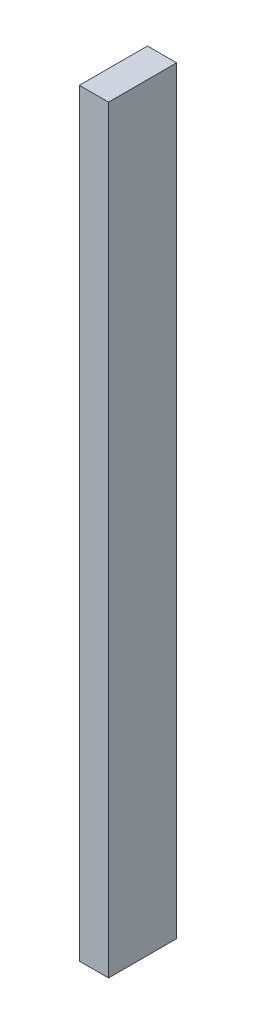
ISO-10303-21;
HEADER;
FILE_DESCRIPTION(('STEP AP214'),'2;1');
FILE_NAME('part.step','',(''),(''),'','','');
FILE_SCHEMA(('AUTOMOTIVE_DESIGN { 1 0 10303 214 1 1 1 1 }'));
ENDSEC;
DATA;
#1=APPLICATION_CONTEXT('core data for automotive mechanical design processes');
#2=APPLICATION_PROTOCOL_DEFINITION('international standard','automotive_design',2000,#1);
#3=PRODUCT_CONTEXT('',#1,'mechanical');
#4=PRODUCT('Part','Part','',(#3));
#5=PRODUCT_RELATED_PRODUCT_CATEGORY('part','',(#4));
#6=PRODUCT_DEFINITION_FORMATION('','',#4);
#7=PRODUCT_DEFINITION_CONTEXT('part definition',#1,'design');
#8=PRODUCT_DEFINITION('design','',#6,#7);
#9=PRODUCT_DEFINITION_SHAPE('','',#8);
#10=(LENGTH_UNIT() NAMED_UNIT(*) SI_UNIT(.MILLI.,.METRE.));
#11=(NAMED_UNIT(*) PLANE_ANGLE_UNIT() SI_UNIT($,.RADIAN.));
#12=(NAMED_UNIT(*) SI_UNIT($,.STERADIAN.) SOLID_ANGLE_UNIT());
#13=UNCERTAINTY_MEASURE_WITH_UNIT(LENGTH_MEASURE(1.E-05),#10,'distance_accuracy_value','');
#14=(GEOMETRIC_REPRESENTATION_CONTEXT(3) GLOBAL_UNCERTAINTY_ASSIGNED_CONTEXT((#13)) GLOBAL_UNIT_ASSIGNED_CONTEXT((#10,
#11,#12)) REPRESENTATION_CONTEXT('',''));
#15=CARTESIAN_POINT('',(0.,0.,0.));
#16=DIRECTION('',(0.,0.,1.));
#17=DIRECTION('',(1.,0.,0.));
#18=AXIS2_PLACEMENT_3D('',#15,#16,#17);
#19=CARTESIAN_POINT('',(19.05,495.3,44.45));
#20=DIRECTION('',(-1.,0.,0.));
#21=DIRECTION('',(0.,0.,1.));
#22=AXIS2_PLACEMENT_3D('',#19,#20,#21);
#23=PLANE('',#22);
#24=DIRECTION('',(0.,0.,-1.));
#25=VECTOR('',#24,1.);
#26=CARTESIAN_POINT('',(19.05,-495.3,44.45));
#27=LINE('',#26,#25);
#28=CARTESIAN_POINT('',(19.05,-495.3,44.45));
#29=VERTEX_POINT('',#28);
#30=CARTESIAN_POINT('',(19.05,-495.3,-44.45));
#31=VERTEX_POINT('',#30);
#32=EDGE_CURVE('E95',#29,#31,#27,.T.);
#33=ORIENTED_EDGE('',*,*,#32,.T.);
#34=DIRECTION('',(0.,-1.,0.));
#35=VECTOR('',#34,1.);
#36=CARTESIAN_POINT('',(19.05,495.3,-44.45));
#37=LINE('',#36,#35);
#38=CARTESIAN_POINT('',(19.05,495.3,-44.45));
#39=VERTEX_POINT('',#38);
#40=EDGE_CURVE('E11',#39,#31,#37,.T.);
#41=ORIENTED_EDGE('',*,*,#40,.F.);
#42=DIRECTION('',(0.,0.,-1.));
#43=VECTOR('',#42,1.);
#44=CARTESIAN_POINT('',(19.05,495.3,44.45));
#45=LINE('',#44,#43);
#46=CARTESIAN_POINT('',(19.05,495.3,44.45));
#47=VERTEX_POINT('',#46);
#48=EDGE_CURVE('E83',#47,#39,#45,.T.);
#49=ORIENTED_EDGE('',*,*,#48,.F.);
#50=DIRECTION('',(0.,-1.,0.));
#51=VECTOR('',#50,1.);
#52=CARTESIAN_POINT('',(19.05,495.3,44.45));
#53=LINE('',#52,#51);
#54=EDGE_CURVE('E91',#47,#29,#53,.T.);
#55=ORIENTED_EDGE('',*,*,#54,.T.);
#56=EDGE_LOOP('',(#33,#41,#49,#55));
#57=FACE_BOUND('',#56,.T.);
#58=ADVANCED_FACE('F32',(#57),#23,.F.);
#59=CARTESIAN_POINT('',(-19.05,495.3,-44.45));
#60=DIRECTION('',(0.,0.,1.));
#61=DIRECTION('',(1.,0.,0.));
#62=AXIS2_PLACEMENT_3D('',#59,#60,#61);
#63=PLANE('',#62);
#64=DIRECTION('',(-1.,0.,0.));
#65=VECTOR('',#64,1.);
#66=CARTESIAN_POINT('',(-19.05,-495.3,-44.45));
#67=LINE('',#66,#65);
#68=CARTESIAN_POINT('',(-19.05,-495.3,-44.45));
#69=VERTEX_POINT('',#68);
#70=EDGE_CURVE('E87',#31,#69,#67,.T.);
#71=ORIENTED_EDGE('',*,*,#70,.T.);
#72=DIRECTION('',(0.,-1.,0.));
#73=VECTOR('',#72,1.);
#74=CARTESIAN_POINT('',(-19.05,495.3,-44.45));
#75=LINE('',#74,#73);
#76=CARTESIAN_POINT('',(-19.05,495.3,-44.45));
#77=VERTEX_POINT('',#76);
#78=EDGE_CURVE('E40',#77,#69,#75,.T.);
#79=ORIENTED_EDGE('',*,*,#78,.F.);
#80=DIRECTION('',(-1.,0.,0.));
#81=VECTOR('',#80,1.);
#82=CARTESIAN_POINT('',(-19.05,495.3,-44.45));
#83=LINE('',#82,#81);
#84=EDGE_CURVE('E78',#39,#77,#83,.T.);
#85=ORIENTED_EDGE('',*,*,#84,.F.);
#86=ORIENTED_EDGE('',*,*,#40,.T.);
#87=EDGE_LOOP('',(#71,#79,#85,#86));
#88=FACE_BOUND('',#87,.T.);
#89=ADVANCED_FACE('F86',(#88),#63,.F.);
#90=CARTESIAN_POINT('',(-19.05,495.3,44.45));
#91=DIRECTION('',(1.,0.,0.));
#92=DIRECTION('',(0.,0.,-1.));
#93=AXIS2_PLACEMENT_3D('',#90,#91,#92);
#94=PLANE('',#93);
#95=DIRECTION('',(0.,0.,1.));
#96=VECTOR('',#95,1.);
#97=CARTESIAN_POINT('',(-19.05,-495.3,44.45));
#98=LINE('',#97,#96);
#99=CARTESIAN_POINT('',(-19.05,-495.3,44.45));
#100=VERTEX_POINT('',#99);
#101=EDGE_CURVE('E65',#69,#100,#98,.T.);
#102=ORIENTED_EDGE('',*,*,#101,.T.);
#103=DIRECTION('',(0.,-1.,0.));
#104=VECTOR('',#103,1.);
#105=CARTESIAN_POINT('',(-19.05,495.3,44.45));
#106=LINE('',#105,#104);
#107=CARTESIAN_POINT('',(-19.05,495.3,44.45));
#108=VERTEX_POINT('',#107);
#109=EDGE_CURVE('E88',#108,#100,#106,.T.);
#110=ORIENTED_EDGE('',*,*,#109,.F.);
#111=DIRECTION('',(0.,0.,1.));
#112=VECTOR('',#111,1.);
#113=CARTESIAN_POINT('',(-19.05,495.3,44.45));
#114=LINE('',#113,#112);
#115=EDGE_CURVE('E81',#77,#108,#114,.T.);
#116=ORIENTED_EDGE('',*,*,#115,.F.);
#117=ORIENTED_EDGE('',*,*,#78,.T.);
#118=EDGE_LOOP('',(#102,#110,#116,#117));
#119=FACE_BOUND('',#118,.T.);
#120=ADVANCED_FACE('F89',(#119),#94,.F.);
#121=CARTESIAN_POINT('',(-19.05,495.3,44.45));
#122=DIRECTION('',(0.,0.,-1.));
#123=DIRECTION('',(-1.,0.,0.));
#124=AXIS2_PLACEMENT_3D('',#121,#122,#123);
#125=PLANE('',#124);
#126=DIRECTION('',(1.,0.,0.));
#127=VECTOR('',#126,1.);
#128=CARTESIAN_POINT('',(-19.05,-495.3,44.45));
#129=LINE('',#128,#127);
#130=EDGE_CURVE('E71',#100,#29,#129,.T.);
#131=ORIENTED_EDGE('',*,*,#130,.T.);
#132=ORIENTED_EDGE('',*,*,#54,.F.);
#133=DIRECTION('',(1.,0.,0.));
#134=VECTOR('',#133,1.);
#135=CARTESIAN_POINT('',(-19.05,495.3,44.45));
#136=LINE('',#135,#134);
#137=EDGE_CURVE('E48',#108,#47,#136,.T.);
#138=ORIENTED_EDGE('',*,*,#137,.F.);
#139=ORIENTED_EDGE('',*,*,#109,.T.);
#140=EDGE_LOOP('',(#131,#132,#138,#139));
#141=FACE_BOUND('',#140,.T.);
#142=ADVANCED_FACE('F102',(#141),#125,.F.);
#143=CARTESIAN_POINT('',(0.,495.3,0.));
#144=DIRECTION('',(0.,-1.,0.));
#145=DIRECTION('',(0.,0.,-1.));
#146=AXIS2_PLACEMENT_3D('',#143,#144,#145);
#147=PLANE('',#146);
#148=ORIENTED_EDGE('',*,*,#48,.T.);
#149=ORIENTED_EDGE('',*,*,#84,.T.);
#150=ORIENTED_EDGE('',*,*,#115,.T.);
#151=ORIENTED_EDGE('',*,*,#137,.T.);
#152=EDGE_LOOP('',(#148,#149,#150,#151));
#153=FACE_BOUND('',#152,.T.);
#154=ADVANCED_FACE('F79',(#153),#147,.F.);
#155=CARTESIAN_POINT('',(0.,-495.3,0.));
#156=DIRECTION('',(0.,-1.,0.));
#157=DIRECTION('',(0.,0.,-1.));
#158=AXIS2_PLACEMENT_3D('',#155,#156,#157);
#159=PLANE('',#158);
#160=ORIENTED_EDGE('',*,*,#32,.F.);
#161=ORIENTED_EDGE('',*,*,#130,.F.);
#162=ORIENTED_EDGE('',*,*,#101,.F.);
#163=ORIENTED_EDGE('',*,*,#70,.F.);
#164=EDGE_LOOP('',(#160,#161,#162,#163));
#165=FACE_BOUND('',#164,.T.);
#166=ADVANCED_FACE('F105',(#165),#159,.T.);
#167=CLOSED_SHELL('',(#58,#89,#120,#142,#154,#166));
#168=MANIFOLD_SOLID_BREP('B2',#167);
#169=ADVANCED_BREP_SHAPE_REPRESENTATION('',(#18,#168),#14);
#170=SHAPE_DEFINITION_REPRESENTATION(#9,#169);
ENDSEC;
END-ISO-10303-21;
